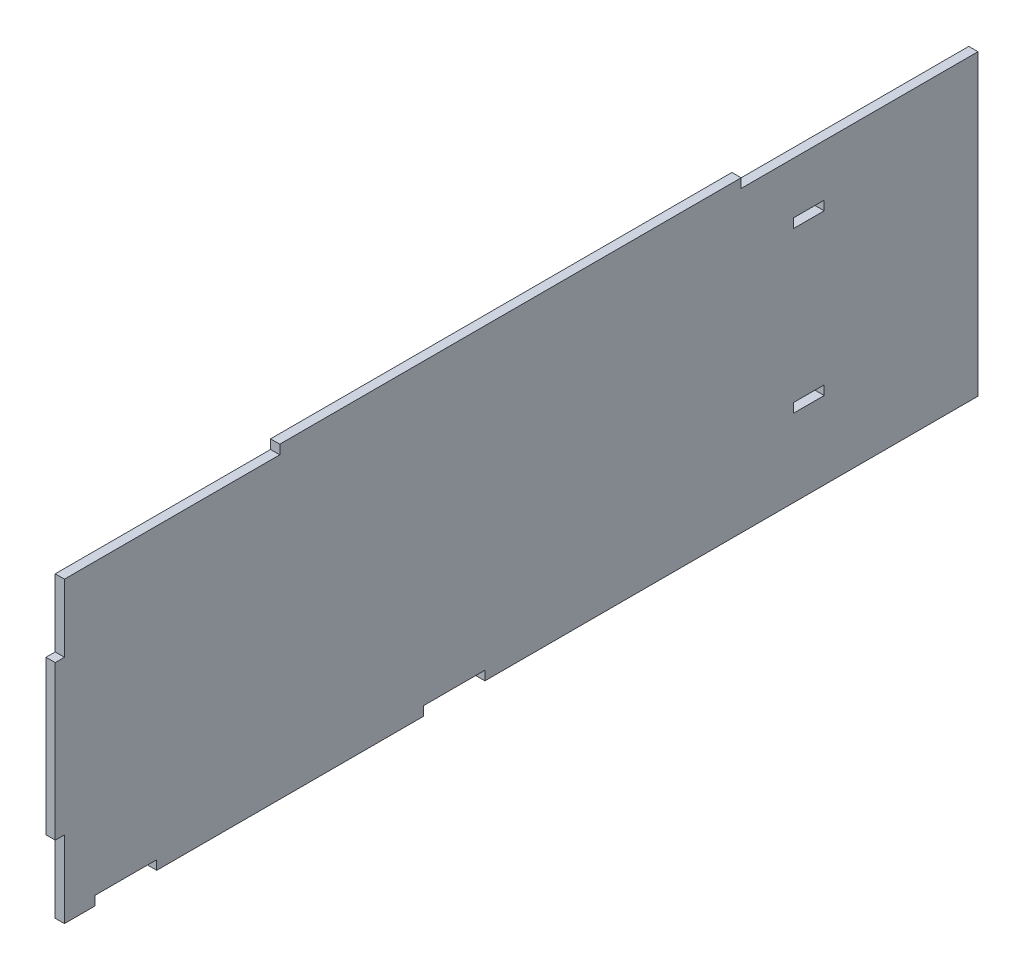
ISO-10303-21;
HEADER;
FILE_DESCRIPTION(('STEP AP214'),'2;1');
FILE_NAME('part.step','',(''),(''),'','','');
FILE_SCHEMA(('AUTOMOTIVE_DESIGN { 1 0 10303 214 1 1 1 1 }'));
ENDSEC;
DATA;
#1=APPLICATION_CONTEXT('core data for automotive mechanical design processes');
#2=APPLICATION_PROTOCOL_DEFINITION('international standard','automotive_design',2000,#1);
#3=PRODUCT_CONTEXT('',#1,'mechanical');
#4=PRODUCT('Part','Part','',(#3));
#5=PRODUCT_RELATED_PRODUCT_CATEGORY('part','',(#4));
#6=PRODUCT_DEFINITION_FORMATION('','',#4);
#7=PRODUCT_DEFINITION_CONTEXT('part definition',#1,'design');
#8=PRODUCT_DEFINITION('design','',#6,#7);
#9=PRODUCT_DEFINITION_SHAPE('','',#8);
#10=(LENGTH_UNIT() NAMED_UNIT(*) SI_UNIT(.MILLI.,.METRE.));
#11=(NAMED_UNIT(*) PLANE_ANGLE_UNIT() SI_UNIT($,.RADIAN.));
#12=(NAMED_UNIT(*) SI_UNIT($,.STERADIAN.) SOLID_ANGLE_UNIT());
#13=UNCERTAINTY_MEASURE_WITH_UNIT(LENGTH_MEASURE(1.E-05),#10,'distance_accuracy_value','');
#14=(GEOMETRIC_REPRESENTATION_CONTEXT(3) GLOBAL_UNCERTAINTY_ASSIGNED_CONTEXT((#13)) GLOBAL_UNIT_ASSIGNED_CONTEXT((#10,
#11,#12)) REPRESENTATION_CONTEXT('',''));
#15=CARTESIAN_POINT('',(0.,0.,0.));
#16=DIRECTION('',(0.,0.,1.));
#17=DIRECTION('',(1.,0.,0.));
#18=AXIS2_PLACEMENT_3D('',#15,#16,#17);
#19=CARTESIAN_POINT('',(3.,25.563482829877,-113.298102998696));
#20=DIRECTION('',(0.,0.,-1.));
#21=DIRECTION('',(-1.,0.,0.));
#22=AXIS2_PLACEMENT_3D('',#19,#20,#21);
#23=PLANE('',#22);
#24=DIRECTION('',(0.,-1.,0.));
#25=VECTOR('',#24,1.);
#26=CARTESIAN_POINT('',(0.,25.563482829877,-113.298102998696));
#27=LINE('',#26,#25);
#28=CARTESIAN_POINT('',(0.,25.563482829877,-113.298102998696));
#29=VERTEX_POINT('',#28);
#30=CARTESIAN_POINT('',(0.,22.563482829877,-113.298102998696));
#31=VERTEX_POINT('',#30);
#32=EDGE_CURVE('E328',#29,#31,#27,.T.);
#33=ORIENTED_EDGE('',*,*,#32,.F.);
#34=DIRECTION('',(-1.,0.,0.));
#35=VECTOR('',#34,1.);
#36=CARTESIAN_POINT('',(3.,25.563482829877,-113.298102998696));
#37=LINE('',#36,#35);
#38=CARTESIAN_POINT('',(3.,25.563482829877,-113.298102998696));
#39=VERTEX_POINT('',#38);
#40=EDGE_CURVE('E220',#39,#29,#37,.T.);
#41=ORIENTED_EDGE('',*,*,#40,.F.);
#42=DIRECTION('',(0.,-1.,0.));
#43=VECTOR('',#42,1.);
#44=CARTESIAN_POINT('',(3.,25.563482829877,-113.298102998696));
#45=LINE('',#44,#43);
#46=CARTESIAN_POINT('',(3.,22.563482829877,-113.298102998696));
#47=VERTEX_POINT('',#46);
#48=EDGE_CURVE('E216',#39,#47,#45,.T.);
#49=ORIENTED_EDGE('',*,*,#48,.T.);
#50=DIRECTION('',(-1.,0.,0.));
#51=VECTOR('',#50,1.);
#52=CARTESIAN_POINT('',(3.,22.563482829877,-113.298102998696));
#53=LINE('',#52,#51);
#54=EDGE_CURVE('E9',#47,#31,#53,.T.);
#55=ORIENTED_EDGE('',*,*,#54,.T.);
#56=EDGE_LOOP('',(#33,#41,#49,#55));
#57=FACE_BOUND('',#56,.T.);
#58=ADVANCED_FACE('F15',(#57),#23,.T.);
#59=CARTESIAN_POINT('',(3.,22.563482829877,-113.298102998696));
#60=DIRECTION('',(0.,1.,0.));
#61=DIRECTION('',(0.,0.,1.));
#62=AXIS2_PLACEMENT_3D('',#59,#60,#61);
#63=PLANE('',#62);
#64=DIRECTION('',(0.,0.,-1.));
#65=VECTOR('',#64,1.);
#66=CARTESIAN_POINT('',(0.,22.563482829877,-113.298102998696));
#67=LINE('',#66,#65);
#68=CARTESIAN_POINT('',(0.,22.563482829877,-123.298102998696));
#69=VERTEX_POINT('',#68);
#70=EDGE_CURVE('E207',#31,#69,#67,.T.);
#71=ORIENTED_EDGE('',*,*,#70,.F.);
#72=ORIENTED_EDGE('',*,*,#54,.F.);
#73=DIRECTION('',(0.,0.,-1.));
#74=VECTOR('',#73,1.);
#75=CARTESIAN_POINT('',(3.,22.563482829877,-113.298102998696));
#76=LINE('',#75,#74);
#77=CARTESIAN_POINT('',(3.,22.563482829877,-123.298102998696));
#78=VERTEX_POINT('',#77);
#79=EDGE_CURVE('E204',#47,#78,#76,.T.);
#80=ORIENTED_EDGE('',*,*,#79,.T.);
#81=DIRECTION('',(-1.,0.,0.));
#82=VECTOR('',#81,1.);
#83=CARTESIAN_POINT('',(3.,22.563482829877,-123.298102998696));
#84=LINE('',#83,#82);
#85=EDGE_CURVE('E25',#78,#69,#84,.T.);
#86=ORIENTED_EDGE('',*,*,#85,.T.);
#87=EDGE_LOOP('',(#71,#72,#80,#86));
#88=FACE_BOUND('',#87,.T.);
#89=ADVANCED_FACE('F203',(#88),#63,.T.);
#90=CARTESIAN_POINT('',(3.,22.563482829877,-123.298102998696));
#91=DIRECTION('',(0.,0.,1.));
#92=DIRECTION('',(1.,0.,0.));
#93=AXIS2_PLACEMENT_3D('',#90,#91,#92);
#94=PLANE('',#93);
#95=DIRECTION('',(0.,1.,0.));
#96=VECTOR('',#95,1.);
#97=CARTESIAN_POINT('',(0.,22.563482829877,-123.298102998696));
#98=LINE('',#97,#96);
#99=CARTESIAN_POINT('',(0.,25.563482829877,-123.298102998696));
#100=VERTEX_POINT('',#99);
#101=EDGE_CURVE('E335',#69,#100,#98,.T.);
#102=ORIENTED_EDGE('',*,*,#101,.F.);
#103=ORIENTED_EDGE('',*,*,#85,.F.);
#104=DIRECTION('',(0.,1.,0.));
#105=VECTOR('',#104,1.);
#106=CARTESIAN_POINT('',(3.,22.563482829877,-123.298102998696));
#107=LINE('',#106,#105);
#108=CARTESIAN_POINT('',(3.,25.563482829877,-123.298102998696));
#109=VERTEX_POINT('',#108);
#110=EDGE_CURVE('E217',#78,#109,#107,.T.);
#111=ORIENTED_EDGE('',*,*,#110,.T.);
#112=DIRECTION('',(-1.,0.,0.));
#113=VECTOR('',#112,1.);
#114=CARTESIAN_POINT('',(3.,25.563482829877,-123.298102998696));
#115=LINE('',#114,#113);
#116=EDGE_CURVE('E118',#109,#100,#115,.T.);
#117=ORIENTED_EDGE('',*,*,#116,.T.);
#118=EDGE_LOOP('',(#102,#103,#111,#117));
#119=FACE_BOUND('',#118,.T.);
#120=ADVANCED_FACE('F459',(#119),#94,.T.);
#121=CARTESIAN_POINT('',(3.,-54.636517170123,113.701897001304));
#122=DIRECTION('',(0.,-1.,0.));
#123=DIRECTION('',(0.,0.,-1.));
#124=AXIS2_PLACEMENT_3D('',#121,#122,#123);
#125=PLANE('',#124);
#126=DIRECTION('',(0.,0.,1.));
#127=VECTOR('',#126,1.);
#128=CARTESIAN_POINT('',(0.,-54.636517170123,113.701897001304));
#129=LINE('',#128,#127);
#130=CARTESIAN_POINT('',(0.,-54.636517170123,113.701897001304));
#131=VERTEX_POINT('',#130);
#132=CARTESIAN_POINT('',(0.,-54.636517170123,123.701897001304));
#133=VERTEX_POINT('',#132);
#134=EDGE_CURVE('E237',#131,#133,#129,.T.);
#135=ORIENTED_EDGE('',*,*,#134,.F.);
#136=DIRECTION('',(-1.,0.,0.));
#137=VECTOR('',#136,1.);
#138=CARTESIAN_POINT('',(3.,-54.636517170123,113.701897001304));
#139=LINE('',#138,#137);
#140=CARTESIAN_POINT('',(3.,-54.636517170123,113.701897001304));
#141=VERTEX_POINT('',#140);
#142=EDGE_CURVE('E351',#141,#131,#139,.T.);
#143=ORIENTED_EDGE('',*,*,#142,.F.);
#144=DIRECTION('',(0.,0.,1.));
#145=VECTOR('',#144,1.);
#146=CARTESIAN_POINT('',(3.,-54.636517170123,113.701897001304));
#147=LINE('',#146,#145);
#148=CARTESIAN_POINT('',(3.,-54.636517170123,123.701897001304));
#149=VERTEX_POINT('',#148);
#150=EDGE_CURVE('E341',#141,#149,#147,.T.);
#151=ORIENTED_EDGE('',*,*,#150,.T.);
#152=DIRECTION('',(-1.,0.,0.));
#153=VECTOR('',#152,1.);
#154=CARTESIAN_POINT('',(3.,-54.636517170123,123.701897001304));
#155=LINE('',#154,#153);
#156=EDGE_CURVE('E19',#149,#133,#155,.T.);
#157=ORIENTED_EDGE('',*,*,#156,.T.);
#158=EDGE_LOOP('',(#135,#143,#151,#157));
#159=FACE_BOUND('',#158,.T.);
#160=ADVANCED_FACE('F17',(#159),#125,.T.);
#161=CARTESIAN_POINT('',(3.,-54.636517170123,123.701897001304));
#162=DIRECTION('',(0.,0.,1.));
#163=DIRECTION('',(1.,0.,0.));
#164=AXIS2_PLACEMENT_3D('',#161,#162,#163);
#165=PLANE('',#164);
#166=DIRECTION('',(0.,1.,0.));
#167=VECTOR('',#166,1.);
#168=CARTESIAN_POINT('',(0.,-54.636517170123,123.701897001304));
#169=LINE('',#168,#167);
#170=CARTESIAN_POINT('',(0.,-29.636517170123,123.701897001304));
#171=VERTEX_POINT('',#170);
#172=EDGE_CURVE('E232',#133,#171,#169,.T.);
#173=ORIENTED_EDGE('',*,*,#172,.F.);
#174=ORIENTED_EDGE('',*,*,#156,.F.);
#175=DIRECTION('',(0.,1.,0.));
#176=VECTOR('',#175,1.);
#177=CARTESIAN_POINT('',(3.,-54.636517170123,123.701897001304));
#178=LINE('',#177,#176);
#179=CARTESIAN_POINT('',(3.,-29.636517170123,123.701897001304));
#180=VERTEX_POINT('',#179);
#181=EDGE_CURVE('E411',#149,#180,#178,.T.);
#182=ORIENTED_EDGE('',*,*,#181,.T.);
#183=DIRECTION('',(-1.,0.,0.));
#184=VECTOR('',#183,1.);
#185=CARTESIAN_POINT('',(3.,-29.636517170123,123.701897001304));
#186=LINE('',#185,#184);
#187=EDGE_CURVE('E387',#180,#171,#186,.T.);
#188=ORIENTED_EDGE('',*,*,#187,.T.);
#189=EDGE_LOOP('',(#173,#174,#182,#188));
#190=FACE_BOUND('',#189,.T.);
#191=ADVANCED_FACE('F393',(#190),#165,.T.);
#192=CARTESIAN_POINT('',(3.,-29.636517170123,123.701897001304));
#193=DIRECTION('',(0.,-1.,0.));
#194=DIRECTION('',(0.,0.,-1.));
#195=AXIS2_PLACEMENT_3D('',#192,#193,#194);
#196=PLANE('',#195);
#197=DIRECTION('',(0.,0.,1.));
#198=VECTOR('',#197,1.);
#199=CARTESIAN_POINT('',(0.,-29.636517170123,123.701897001304));
#200=LINE('',#199,#198);
#201=CARTESIAN_POINT('',(0.,-29.636517170123,126.701897001304));
#202=VERTEX_POINT('',#201);
#203=EDGE_CURVE('E236',#171,#202,#200,.T.);
#204=ORIENTED_EDGE('',*,*,#203,.F.);
#205=ORIENTED_EDGE('',*,*,#187,.F.);
#206=DIRECTION('',(0.,0.,1.));
#207=VECTOR('',#206,1.);
#208=CARTESIAN_POINT('',(3.,-29.636517170123,123.701897001304));
#209=LINE('',#208,#207);
#210=CARTESIAN_POINT('',(3.,-29.636517170123,126.701897001304));
#211=VERTEX_POINT('',#210);
#212=EDGE_CURVE('E413',#180,#211,#209,.T.);
#213=ORIENTED_EDGE('',*,*,#212,.T.);
#214=DIRECTION('',(-1.,0.,0.));
#215=VECTOR('',#214,1.);
#216=CARTESIAN_POINT('',(3.,-29.636517170123,126.701897001304));
#217=LINE('',#216,#215);
#218=EDGE_CURVE('E386',#211,#202,#217,.T.);
#219=ORIENTED_EDGE('',*,*,#218,.T.);
#220=EDGE_LOOP('',(#204,#205,#213,#219));
#221=FACE_BOUND('',#220,.T.);
#222=ADVANCED_FACE('F533',(#221),#196,.T.);
#223=CARTESIAN_POINT('',(3.,-29.636517170123,126.701897001304));
#224=DIRECTION('',(0.,0.,1.));
#225=DIRECTION('',(1.,0.,0.));
#226=AXIS2_PLACEMENT_3D('',#223,#224,#225);
#227=PLANE('',#226);
#228=DIRECTION('',(0.,1.,0.));
#229=VECTOR('',#228,1.);
#230=CARTESIAN_POINT('',(0.,-29.636517170123,126.701897001304));
#231=LINE('',#230,#229);
#232=CARTESIAN_POINT('',(0.,20.363482829877,126.701897001304));
#233=VERTEX_POINT('',#232);
#234=EDGE_CURVE('E241',#202,#233,#231,.T.);
#235=ORIENTED_EDGE('',*,*,#234,.F.);
#236=ORIENTED_EDGE('',*,*,#218,.F.);
#237=DIRECTION('',(0.,1.,0.));
#238=VECTOR('',#237,1.);
#239=CARTESIAN_POINT('',(3.,-29.636517170123,126.701897001304));
#240=LINE('',#239,#238);
#241=CARTESIAN_POINT('',(3.,20.363482829877,126.701897001304));
#242=VERTEX_POINT('',#241);
#243=EDGE_CURVE('E916',#211,#242,#240,.T.);
#244=ORIENTED_EDGE('',*,*,#243,.T.);
#245=DIRECTION('',(-1.,0.,0.));
#246=VECTOR('',#245,1.);
#247=CARTESIAN_POINT('',(3.,20.363482829877,126.701897001304));
#248=LINE('',#247,#246);
#249=EDGE_CURVE('E384',#242,#233,#248,.T.);
#250=ORIENTED_EDGE('',*,*,#249,.T.);
#251=EDGE_LOOP('',(#235,#236,#244,#250));
#252=FACE_BOUND('',#251,.T.);
#253=ADVANCED_FACE('F529',(#252),#227,.T.);
#254=CARTESIAN_POINT('',(3.,20.363482829877,126.701897001304));
#255=DIRECTION('',(0.,1.,0.));
#256=DIRECTION('',(0.,0.,1.));
#257=AXIS2_PLACEMENT_3D('',#254,#255,#256);
#258=PLANE('',#257);
#259=DIRECTION('',(0.,0.,-1.));
#260=VECTOR('',#259,1.);
#261=CARTESIAN_POINT('',(0.,20.363482829877,126.701897001304));
#262=LINE('',#261,#260);
#263=CARTESIAN_POINT('',(0.,20.363482829877,123.701897001304));
#264=VERTEX_POINT('',#263);
#265=EDGE_CURVE('E245',#233,#264,#262,.T.);
#266=ORIENTED_EDGE('',*,*,#265,.F.);
#267=ORIENTED_EDGE('',*,*,#249,.F.);
#268=DIRECTION('',(0.,0.,-1.));
#269=VECTOR('',#268,1.);
#270=CARTESIAN_POINT('',(3.,20.363482829877,126.701897001304));
#271=LINE('',#270,#269);
#272=CARTESIAN_POINT('',(3.,20.363482829877,123.701897001304));
#273=VERTEX_POINT('',#272);
#274=EDGE_CURVE('E920',#242,#273,#271,.T.);
#275=ORIENTED_EDGE('',*,*,#274,.T.);
#276=DIRECTION('',(-1.,0.,0.));
#277=VECTOR('',#276,1.);
#278=CARTESIAN_POINT('',(3.,20.363482829877,123.701897001304));
#279=LINE('',#278,#277);
#280=EDGE_CURVE('E382',#273,#264,#279,.T.);
#281=ORIENTED_EDGE('',*,*,#280,.T.);
#282=EDGE_LOOP('',(#266,#267,#275,#281));
#283=FACE_BOUND('',#282,.T.);
#284=ADVANCED_FACE('F525',(#283),#258,.T.);
#285=CARTESIAN_POINT('',(3.,20.363482829877,123.701897001304));
#286=DIRECTION('',(0.,0.,1.));
#287=DIRECTION('',(1.,0.,0.));
#288=AXIS2_PLACEMENT_3D('',#285,#286,#287);
#289=PLANE('',#288);
#290=DIRECTION('',(0.,1.,0.));
#291=VECTOR('',#290,1.);
#292=CARTESIAN_POINT('',(0.,20.363482829877,123.701897001304));
#293=LINE('',#292,#291);
#294=CARTESIAN_POINT('',(0.,42.363482829877,123.701897001304));
#295=VERTEX_POINT('',#294);
#296=EDGE_CURVE('E249',#264,#295,#293,.T.);
#297=ORIENTED_EDGE('',*,*,#296,.F.);
#298=ORIENTED_EDGE('',*,*,#280,.F.);
#299=DIRECTION('',(0.,1.,0.));
#300=VECTOR('',#299,1.);
#301=CARTESIAN_POINT('',(3.,20.363482829877,123.701897001304));
#302=LINE('',#301,#300);
#303=CARTESIAN_POINT('',(3.,42.363482829877,123.701897001304));
#304=VERTEX_POINT('',#303);
#305=EDGE_CURVE('E984',#273,#304,#302,.T.);
#306=ORIENTED_EDGE('',*,*,#305,.T.);
#307=DIRECTION('',(-1.,0.,0.));
#308=VECTOR('',#307,1.);
#309=CARTESIAN_POINT('',(3.,42.363482829877,123.701897001304));
#310=LINE('',#309,#308);
#311=EDGE_CURVE('E380',#304,#295,#310,.T.);
#312=ORIENTED_EDGE('',*,*,#311,.T.);
#313=EDGE_LOOP('',(#297,#298,#306,#312));
#314=FACE_BOUND('',#313,.T.);
#315=ADVANCED_FACE('F521',(#314),#289,.T.);
#316=CARTESIAN_POINT('',(3.,42.363482829877,123.701897001304));
#317=DIRECTION('',(0.,1.,0.));
#318=DIRECTION('',(0.,0.,1.));
#319=AXIS2_PLACEMENT_3D('',#316,#317,#318);
#320=PLANE('',#319);
#321=DIRECTION('',(0.,0.,-1.));
#322=VECTOR('',#321,1.);
#323=CARTESIAN_POINT('',(0.,42.363482829877,123.701897001304));
#324=LINE('',#323,#322);
#325=CARTESIAN_POINT('',(0.,42.363482829877,53.7018970013037));
#326=VERTEX_POINT('',#325);
#327=EDGE_CURVE('E253',#295,#326,#324,.T.);
#328=ORIENTED_EDGE('',*,*,#327,.F.);
#329=ORIENTED_EDGE('',*,*,#311,.F.);
#330=DIRECTION('',(0.,0.,-1.));
#331=VECTOR('',#330,1.);
#332=CARTESIAN_POINT('',(3.,42.363482829877,123.701897001304));
#333=LINE('',#332,#331);
#334=CARTESIAN_POINT('',(3.,42.363482829877,53.7018970013037));
#335=VERTEX_POINT('',#334);
#336=EDGE_CURVE('E927',#304,#335,#333,.T.);
#337=ORIENTED_EDGE('',*,*,#336,.T.);
#338=DIRECTION('',(-1.,0.,0.));
#339=VECTOR('',#338,1.);
#340=CARTESIAN_POINT('',(3.,42.363482829877,53.7018970013037));
#341=LINE('',#340,#339);
#342=EDGE_CURVE('E378',#335,#326,#341,.T.);
#343=ORIENTED_EDGE('',*,*,#342,.T.);
#344=EDGE_LOOP('',(#328,#329,#337,#343));
#345=FACE_BOUND('',#344,.T.);
#346=ADVANCED_FACE('F517',(#345),#320,.T.);
#347=CARTESIAN_POINT('',(3.,42.363482829877,53.7018970013037));
#348=DIRECTION('',(0.,0.,1.));
#349=DIRECTION('',(1.,0.,0.));
#350=AXIS2_PLACEMENT_3D('',#347,#348,#349);
#351=PLANE('',#350);
#352=DIRECTION('',(0.,1.,0.));
#353=VECTOR('',#352,1.);
#354=CARTESIAN_POINT('',(0.,42.363482829877,53.7018970013037));
#355=LINE('',#354,#353);
#356=CARTESIAN_POINT('',(0.,45.363482829877,53.7018970013037));
#357=VERTEX_POINT('',#356);
#358=EDGE_CURVE('E257',#326,#357,#355,.T.);
#359=ORIENTED_EDGE('',*,*,#358,.F.);
#360=ORIENTED_EDGE('',*,*,#342,.F.);
#361=DIRECTION('',(0.,1.,0.));
#362=VECTOR('',#361,1.);
#363=CARTESIAN_POINT('',(3.,42.363482829877,53.7018970013037));
#364=LINE('',#363,#362);
#365=CARTESIAN_POINT('',(3.,45.363482829877,53.7018970013037));
#366=VERTEX_POINT('',#365);
#367=EDGE_CURVE('E931',#335,#366,#364,.T.);
#368=ORIENTED_EDGE('',*,*,#367,.T.);
#369=DIRECTION('',(-1.,0.,0.));
#370=VECTOR('',#369,1.);
#371=CARTESIAN_POINT('',(3.,45.363482829877,53.7018970013037));
#372=LINE('',#371,#370);
#373=EDGE_CURVE('E376',#366,#357,#372,.T.);
#374=ORIENTED_EDGE('',*,*,#373,.T.);
#375=EDGE_LOOP('',(#359,#360,#368,#374));
#376=FACE_BOUND('',#375,.T.);
#377=ADVANCED_FACE('F513',(#376),#351,.T.);
#378=CARTESIAN_POINT('',(3.,45.363482829877,53.7018970013037));
#379=DIRECTION('',(0.,1.,0.));
#380=DIRECTION('',(0.,0.,1.));
#381=AXIS2_PLACEMENT_3D('',#378,#379,#380);
#382=PLANE('',#381);
#383=DIRECTION('',(0.,0.,-1.));
#384=VECTOR('',#383,1.);
#385=CARTESIAN_POINT('',(0.,45.363482829877,53.7018970013037));
#386=LINE('',#385,#384);
#387=CARTESIAN_POINT('',(0.,45.363482829877,-96.2981029986963));
#388=VERTEX_POINT('',#387);
#389=EDGE_CURVE('E261',#357,#388,#386,.T.);
#390=ORIENTED_EDGE('',*,*,#389,.F.);
#391=ORIENTED_EDGE('',*,*,#373,.F.);
#392=DIRECTION('',(0.,0.,-1.));
#393=VECTOR('',#392,1.);
#394=CARTESIAN_POINT('',(3.,45.363482829877,53.7018970013037));
#395=LINE('',#394,#393);
#396=CARTESIAN_POINT('',(3.,45.363482829877,-96.2981029986963));
#397=VERTEX_POINT('',#396);
#398=EDGE_CURVE('E980',#366,#397,#395,.T.);
#399=ORIENTED_EDGE('',*,*,#398,.T.);
#400=DIRECTION('',(-1.,0.,0.));
#401=VECTOR('',#400,1.);
#402=CARTESIAN_POINT('',(3.,45.363482829877,-96.2981029986963));
#403=LINE('',#402,#401);
#404=EDGE_CURVE('E374',#397,#388,#403,.T.);
#405=ORIENTED_EDGE('',*,*,#404,.T.);
#406=EDGE_LOOP('',(#390,#391,#399,#405));
#407=FACE_BOUND('',#406,.T.);
#408=ADVANCED_FACE('F509',(#407),#382,.T.);
#409=CARTESIAN_POINT('',(3.,45.363482829877,-96.2981029986963));
#410=DIRECTION('',(0.,0.,-1.));
#411=DIRECTION('',(-1.,0.,0.));
#412=AXIS2_PLACEMENT_3D('',#409,#410,#411);
#413=PLANE('',#412);
#414=DIRECTION('',(0.,-1.,0.));
#415=VECTOR('',#414,1.);
#416=CARTESIAN_POINT('',(0.,45.363482829877,-96.2981029986963));
#417=LINE('',#416,#415);
#418=CARTESIAN_POINT('',(0.,42.363482829877,-96.2981029986963));
#419=VERTEX_POINT('',#418);
#420=EDGE_CURVE('E265',#388,#419,#417,.T.);
#421=ORIENTED_EDGE('',*,*,#420,.F.);
#422=ORIENTED_EDGE('',*,*,#404,.F.);
#423=DIRECTION('',(0.,-1.,0.));
#424=VECTOR('',#423,1.);
#425=CARTESIAN_POINT('',(3.,45.363482829877,-96.2981029986963));
#426=LINE('',#425,#424);
#427=CARTESIAN_POINT('',(3.,42.363482829877,-96.2981029986963));
#428=VERTEX_POINT('',#427);
#429=EDGE_CURVE('E938',#397,#428,#426,.T.);
#430=ORIENTED_EDGE('',*,*,#429,.T.);
#431=DIRECTION('',(-1.,0.,0.));
#432=VECTOR('',#431,1.);
#433=CARTESIAN_POINT('',(3.,42.363482829877,-96.2981029986963));
#434=LINE('',#433,#432);
#435=EDGE_CURVE('E372',#428,#419,#434,.T.);
#436=ORIENTED_EDGE('',*,*,#435,.T.);
#437=EDGE_LOOP('',(#421,#422,#430,#436));
#438=FACE_BOUND('',#437,.T.);
#439=ADVANCED_FACE('F505',(#438),#413,.T.);
#440=CARTESIAN_POINT('',(3.,42.363482829877,-96.2981029986963));
#441=DIRECTION('',(0.,1.,0.));
#442=DIRECTION('',(0.,0.,1.));
#443=AXIS2_PLACEMENT_3D('',#440,#441,#442);
#444=PLANE('',#443);
#445=DIRECTION('',(0.,0.,-1.));
#446=VECTOR('',#445,1.);
#447=CARTESIAN_POINT('',(0.,42.363482829877,-96.2981029986963));
#448=LINE('',#447,#446);
#449=CARTESIAN_POINT('',(0.,42.363482829877,-173.298102998696));
#450=VERTEX_POINT('',#449);
#451=EDGE_CURVE('E269',#419,#450,#448,.T.);
#452=ORIENTED_EDGE('',*,*,#451,.F.);
#453=ORIENTED_EDGE('',*,*,#435,.F.);
#454=DIRECTION('',(0.,0.,-1.));
#455=VECTOR('',#454,1.);
#456=CARTESIAN_POINT('',(3.,42.363482829877,-96.2981029986963));
#457=LINE('',#456,#455);
#458=CARTESIAN_POINT('',(3.,42.363482829877,-173.298102998696));
#459=VERTEX_POINT('',#458);
#460=EDGE_CURVE('E942',#428,#459,#457,.T.);
#461=ORIENTED_EDGE('',*,*,#460,.T.);
#462=DIRECTION('',(-1.,0.,0.));
#463=VECTOR('',#462,1.);
#464=CARTESIAN_POINT('',(3.,42.363482829877,-173.298102998696));
#465=LINE('',#464,#463);
#466=EDGE_CURVE('E370',#459,#450,#465,.T.);
#467=ORIENTED_EDGE('',*,*,#466,.T.);
#468=EDGE_LOOP('',(#452,#453,#461,#467));
#469=FACE_BOUND('',#468,.T.);
#470=ADVANCED_FACE('F501',(#469),#444,.T.);
#471=CARTESIAN_POINT('',(3.,42.363482829877,-173.298102998696));
#472=DIRECTION('',(0.,0.,-1.));
#473=DIRECTION('',(-1.,0.,0.));
#474=AXIS2_PLACEMENT_3D('',#471,#472,#473);
#475=PLANE('',#474);
#476=DIRECTION('',(0.,-1.,0.));
#477=VECTOR('',#476,1.);
#478=CARTESIAN_POINT('',(0.,42.363482829877,-173.298102998696));
#479=LINE('',#478,#477);
#480=CARTESIAN_POINT('',(0.,-54.636517170123,-173.298102998696));
#481=VERTEX_POINT('',#480);
#482=EDGE_CURVE('E273',#450,#481,#479,.T.);
#483=ORIENTED_EDGE('',*,*,#482,.F.);
#484=ORIENTED_EDGE('',*,*,#466,.F.);
#485=DIRECTION('',(0.,-1.,0.));
#486=VECTOR('',#485,1.);
#487=CARTESIAN_POINT('',(3.,42.363482829877,-173.298102998696));
#488=LINE('',#487,#486);
#489=CARTESIAN_POINT('',(3.,-54.636517170123,-173.298102998696));
#490=VERTEX_POINT('',#489);
#491=EDGE_CURVE('E976',#459,#490,#488,.T.);
#492=ORIENTED_EDGE('',*,*,#491,.T.);
#493=DIRECTION('',(-1.,0.,0.));
#494=VECTOR('',#493,1.);
#495=CARTESIAN_POINT('',(3.,-54.636517170123,-173.298102998696));
#496=LINE('',#495,#494);
#497=EDGE_CURVE('E368',#490,#481,#496,.T.);
#498=ORIENTED_EDGE('',*,*,#497,.T.);
#499=EDGE_LOOP('',(#483,#484,#492,#498));
#500=FACE_BOUND('',#499,.T.);
#501=ADVANCED_FACE('F497',(#500),#475,.T.);
#502=CARTESIAN_POINT('',(3.,-54.636517170123,-173.298102998696));
#503=DIRECTION('',(0.,-1.,0.));
#504=DIRECTION('',(0.,0.,-1.));
#505=AXIS2_PLACEMENT_3D('',#502,#503,#504);
#506=PLANE('',#505);
#507=DIRECTION('',(0.,0.,1.));
#508=VECTOR('',#507,1.);
#509=CARTESIAN_POINT('',(0.,-54.636517170123,-173.298102998696));
#510=LINE('',#509,#508);
#511=CARTESIAN_POINT('',(0.,-54.636517170123,-12.9981029986962));
#512=VERTEX_POINT('',#511);
#513=EDGE_CURVE('E277',#481,#512,#510,.T.);
#514=ORIENTED_EDGE('',*,*,#513,.F.);
#515=ORIENTED_EDGE('',*,*,#497,.F.);
#516=DIRECTION('',(0.,0.,1.));
#517=VECTOR('',#516,1.);
#518=CARTESIAN_POINT('',(3.,-54.636517170123,-173.298102998696));
#519=LINE('',#518,#517);
#520=CARTESIAN_POINT('',(3.,-54.636517170123,-12.9981029986962));
#521=VERTEX_POINT('',#520);
#522=EDGE_CURVE('E949',#490,#521,#519,.T.);
#523=ORIENTED_EDGE('',*,*,#522,.T.);
#524=DIRECTION('',(-1.,0.,0.));
#525=VECTOR('',#524,1.);
#526=CARTESIAN_POINT('',(3.,-54.636517170123,-12.9981029986962));
#527=LINE('',#526,#525);
#528=EDGE_CURVE('E366',#521,#512,#527,.T.);
#529=ORIENTED_EDGE('',*,*,#528,.T.);
#530=EDGE_LOOP('',(#514,#515,#523,#529));
#531=FACE_BOUND('',#530,.T.);
#532=ADVANCED_FACE('F493',(#531),#506,.T.);
#533=CARTESIAN_POINT('',(3.,-51.636517170123,-12.9981029986963));
#534=DIRECTION('',(0.,0.,1.));
#535=DIRECTION('',(1.,0.,0.));
#536=AXIS2_PLACEMENT_3D('',#533,#534,#535);
#537=PLANE('',#536);
#538=DIRECTION('',(0.,1.,0.));
#539=VECTOR('',#538,1.);
#540=CARTESIAN_POINT('',(0.,-51.636517170123,-12.9981029986963));
#541=LINE('',#540,#539);
#542=CARTESIAN_POINT('',(0.,-51.636517170123,-12.9981029986963));
#543=VERTEX_POINT('',#542);
#544=EDGE_CURVE('E281',#512,#543,#541,.T.);
#545=ORIENTED_EDGE('',*,*,#544,.F.);
#546=ORIENTED_EDGE('',*,*,#528,.F.);
#547=DIRECTION('',(0.,1.,0.));
#548=VECTOR('',#547,1.);
#549=CARTESIAN_POINT('',(3.,-51.636517170123,-12.9981029986963));
#550=LINE('',#549,#548);
#551=CARTESIAN_POINT('',(3.,-51.636517170123,-12.9981029986963));
#552=VERTEX_POINT('',#551);
#553=EDGE_CURVE('E953',#521,#552,#550,.T.);
#554=ORIENTED_EDGE('',*,*,#553,.T.);
#555=DIRECTION('',(-1.,0.,0.));
#556=VECTOR('',#555,1.);
#557=CARTESIAN_POINT('',(3.,-51.636517170123,-12.9981029986963));
#558=LINE('',#557,#556);
#559=EDGE_CURVE('E364',#552,#543,#558,.T.);
#560=ORIENTED_EDGE('',*,*,#559,.T.);
#561=EDGE_LOOP('',(#545,#546,#554,#560));
#562=FACE_BOUND('',#561,.T.);
#563=ADVANCED_FACE('F489',(#562),#537,.T.);
#564=CARTESIAN_POINT('',(3.,-51.636517170123,7.00189700130374));
#565=DIRECTION('',(0.,-1.,0.));
#566=DIRECTION('',(0.,0.,-1.));
#567=AXIS2_PLACEMENT_3D('',#564,#565,#566);
#568=PLANE('',#567);
#569=DIRECTION('',(0.,0.,1.));
#570=VECTOR('',#569,1.);
#571=CARTESIAN_POINT('',(0.,-51.636517170123,7.00189700130374));
#572=LINE('',#571,#570);
#573=CARTESIAN_POINT('',(0.,-51.636517170123,7.00189700130374));
#574=VERTEX_POINT('',#573);
#575=EDGE_CURVE('E285',#543,#574,#572,.T.);
#576=ORIENTED_EDGE('',*,*,#575,.F.);
#577=ORIENTED_EDGE('',*,*,#559,.F.);
#578=DIRECTION('',(0.,0.,1.));
#579=VECTOR('',#578,1.);
#580=CARTESIAN_POINT('',(3.,-51.636517170123,7.00189700130374));
#581=LINE('',#580,#579);
#582=CARTESIAN_POINT('',(3.,-51.636517170123,7.00189700130374));
#583=VERTEX_POINT('',#582);
#584=EDGE_CURVE('E972',#552,#583,#581,.T.);
#585=ORIENTED_EDGE('',*,*,#584,.T.);
#586=DIRECTION('',(-1.,0.,0.));
#587=VECTOR('',#586,1.);
#588=CARTESIAN_POINT('',(3.,-51.636517170123,7.00189700130374));
#589=LINE('',#588,#587);
#590=EDGE_CURVE('E362',#583,#574,#589,.T.);
#591=ORIENTED_EDGE('',*,*,#590,.T.);
#592=EDGE_LOOP('',(#576,#577,#585,#591));
#593=FACE_BOUND('',#592,.T.);
#594=ADVANCED_FACE('F485',(#593),#568,.T.);
#595=CARTESIAN_POINT('',(3.,-54.636517170123,7.00189700130374));
#596=DIRECTION('',(0.,0.,-1.));
#597=DIRECTION('',(-1.,0.,0.));
#598=AXIS2_PLACEMENT_3D('',#595,#596,#597);
#599=PLANE('',#598);
#600=DIRECTION('',(0.,-1.,0.));
#601=VECTOR('',#600,1.);
#602=CARTESIAN_POINT('',(0.,-54.636517170123,7.00189700130374));
#603=LINE('',#602,#601);
#604=CARTESIAN_POINT('',(0.,-54.636517170123,7.00189700130374));
#605=VERTEX_POINT('',#604);
#606=EDGE_CURVE('E289',#574,#605,#603,.T.);
#607=ORIENTED_EDGE('',*,*,#606,.F.);
#608=ORIENTED_EDGE('',*,*,#590,.F.);
#609=DIRECTION('',(0.,-1.,0.));
#610=VECTOR('',#609,1.);
#611=CARTESIAN_POINT('',(3.,-54.636517170123,7.00189700130374));
#612=LINE('',#611,#610);
#613=CARTESIAN_POINT('',(3.,-54.636517170123,7.00189700130374));
#614=VERTEX_POINT('',#613);
#615=EDGE_CURVE('E960',#583,#614,#612,.T.);
#616=ORIENTED_EDGE('',*,*,#615,.T.);
#617=DIRECTION('',(-1.,0.,0.));
#618=VECTOR('',#617,1.);
#619=CARTESIAN_POINT('',(3.,-54.636517170123,7.00189700130374));
#620=LINE('',#619,#618);
#621=EDGE_CURVE('E360',#614,#605,#620,.T.);
#622=ORIENTED_EDGE('',*,*,#621,.T.);
#623=EDGE_LOOP('',(#607,#608,#616,#622));
#624=FACE_BOUND('',#623,.T.);
#625=ADVANCED_FACE('F481',(#624),#599,.T.);
#626=CARTESIAN_POINT('',(3.,-54.636517170123,7.00189700130374));
#627=DIRECTION('',(0.,-1.,0.));
#628=DIRECTION('',(0.,0.,-1.));
#629=AXIS2_PLACEMENT_3D('',#626,#627,#628);
#630=PLANE('',#629);
#631=DIRECTION('',(0.,0.,1.));
#632=VECTOR('',#631,1.);
#633=CARTESIAN_POINT('',(0.,-54.636517170123,7.00189700130374));
#634=LINE('',#633,#632);
#635=CARTESIAN_POINT('',(0.,-54.636517170123,93.7018970013037));
#636=VERTEX_POINT('',#635);
#637=EDGE_CURVE('E293',#605,#636,#634,.T.);
#638=ORIENTED_EDGE('',*,*,#637,.F.);
#639=ORIENTED_EDGE('',*,*,#621,.F.);
#640=DIRECTION('',(0.,0.,1.));
#641=VECTOR('',#640,1.);
#642=CARTESIAN_POINT('',(3.,-54.636517170123,7.00189700130374));
#643=LINE('',#642,#641);
#644=CARTESIAN_POINT('',(3.,-54.636517170123,93.7018970013037));
#645=VERTEX_POINT('',#644);
#646=EDGE_CURVE('E964',#614,#645,#643,.T.);
#647=ORIENTED_EDGE('',*,*,#646,.T.);
#648=DIRECTION('',(-1.,0.,0.));
#649=VECTOR('',#648,1.);
#650=CARTESIAN_POINT('',(3.,-54.636517170123,93.7018970013037));
#651=LINE('',#650,#649);
#652=EDGE_CURVE('E358',#645,#636,#651,.T.);
#653=ORIENTED_EDGE('',*,*,#652,.T.);
#654=EDGE_LOOP('',(#638,#639,#647,#653));
#655=FACE_BOUND('',#654,.T.);
#656=ADVANCED_FACE('F477',(#655),#630,.T.);
#657=CARTESIAN_POINT('',(3.,-54.636517170123,93.7018970013037));
#658=DIRECTION('',(0.,0.,1.));
#659=DIRECTION('',(1.,0.,0.));
#660=AXIS2_PLACEMENT_3D('',#657,#658,#659);
#661=PLANE('',#660);
#662=DIRECTION('',(0.,1.,0.));
#663=VECTOR('',#662,1.);
#664=CARTESIAN_POINT('',(0.,-54.636517170123,93.7018970013037));
#665=LINE('',#664,#663);
#666=CARTESIAN_POINT('',(0.,-51.636517170123,93.7018970013037));
#667=VERTEX_POINT('',#666);
#668=EDGE_CURVE('E297',#636,#667,#665,.T.);
#669=ORIENTED_EDGE('',*,*,#668,.F.);
#670=ORIENTED_EDGE('',*,*,#652,.F.);
#671=DIRECTION('',(0.,1.,0.));
#672=VECTOR('',#671,1.);
#673=CARTESIAN_POINT('',(3.,-54.636517170123,93.7018970013037));
#674=LINE('',#673,#672);
#675=CARTESIAN_POINT('',(3.,-51.636517170123,93.7018970013037));
#676=VERTEX_POINT('',#675);
#677=EDGE_CURVE('E967',#645,#676,#674,.T.);
#678=ORIENTED_EDGE('',*,*,#677,.T.);
#679=DIRECTION('',(-1.,0.,0.));
#680=VECTOR('',#679,1.);
#681=CARTESIAN_POINT('',(3.,-51.636517170123,93.7018970013037));
#682=LINE('',#681,#680);
#683=EDGE_CURVE('E356',#676,#667,#682,.T.);
#684=ORIENTED_EDGE('',*,*,#683,.T.);
#685=EDGE_LOOP('',(#669,#670,#678,#684));
#686=FACE_BOUND('',#685,.T.);
#687=ADVANCED_FACE('F449',(#686),#661,.T.);
#688=CARTESIAN_POINT('',(3.,-51.636517170123,93.7018970013037));
#689=DIRECTION('',(0.,-1.,0.));
#690=DIRECTION('',(0.,0.,-1.));
#691=AXIS2_PLACEMENT_3D('',#688,#689,#690);
#692=PLANE('',#691);
#693=DIRECTION('',(0.,0.,1.));
#694=VECTOR('',#693,1.);
#695=CARTESIAN_POINT('',(0.,-51.636517170123,93.7018970013037));
#696=LINE('',#695,#694);
#697=CARTESIAN_POINT('',(0.,-51.636517170123,113.701897001304));
#698=VERTEX_POINT('',#697);
#699=EDGE_CURVE('E301',#667,#698,#696,.T.);
#700=ORIENTED_EDGE('',*,*,#699,.F.);
#701=ORIENTED_EDGE('',*,*,#683,.F.);
#702=DIRECTION('',(0.,0.,1.));
#703=VECTOR('',#702,1.);
#704=CARTESIAN_POINT('',(3.,-51.636517170123,93.7018970013037));
#705=LINE('',#704,#703);
#706=CARTESIAN_POINT('',(3.,-51.636517170123,113.701897001304));
#707=VERTEX_POINT('',#706);
#708=EDGE_CURVE('E408',#676,#707,#705,.T.);
#709=ORIENTED_EDGE('',*,*,#708,.T.);
#710=DIRECTION('',(-1.,0.,0.));
#711=VECTOR('',#710,1.);
#712=CARTESIAN_POINT('',(3.,-51.636517170123,113.701897001304));
#713=LINE('',#712,#711);
#714=EDGE_CURVE('E354',#707,#698,#713,.T.);
#715=ORIENTED_EDGE('',*,*,#714,.T.);
#716=EDGE_LOOP('',(#700,#701,#709,#715));
#717=FACE_BOUND('',#716,.T.);
#718=ADVANCED_FACE('F441',(#717),#692,.T.);
#719=CARTESIAN_POINT('',(3.,-29.436517170123,-123.298102998696));
#720=DIRECTION('',(0.,0.,1.));
#721=DIRECTION('',(1.,0.,0.));
#722=AXIS2_PLACEMENT_3D('',#719,#720,#721);
#723=PLANE('',#722);
#724=DIRECTION('',(0.,1.,0.));
#725=VECTOR('',#724,1.);
#726=CARTESIAN_POINT('',(0.,-29.436517170123,-123.298102998696));
#727=LINE('',#726,#725);
#728=CARTESIAN_POINT('',(0.,-29.436517170123,-123.298102998696));
#729=VERTEX_POINT('',#728);
#730=CARTESIAN_POINT('',(0.,-26.436517170123,-123.298102998696));
#731=VERTEX_POINT('',#730);
#732=EDGE_CURVE('E309',#729,#731,#727,.T.);
#733=ORIENTED_EDGE('',*,*,#732,.F.);
#734=DIRECTION('',(-1.,0.,0.));
#735=VECTOR('',#734,1.);
#736=CARTESIAN_POINT('',(3.,-29.436517170123,-123.298102998696));
#737=LINE('',#736,#735);
#738=CARTESIAN_POINT('',(3.,-29.436517170123,-123.298102998696));
#739=VERTEX_POINT('',#738);
#740=EDGE_CURVE('E218',#739,#729,#737,.T.);
#741=ORIENTED_EDGE('',*,*,#740,.F.);
#742=DIRECTION('',(0.,1.,0.));
#743=VECTOR('',#742,1.);
#744=CARTESIAN_POINT('',(3.,-29.436517170123,-123.298102998696));
#745=LINE('',#744,#743);
#746=CARTESIAN_POINT('',(3.,-26.436517170123,-123.298102998696));
#747=VERTEX_POINT('',#746);
#748=EDGE_CURVE('E407',#739,#747,#745,.T.);
#749=ORIENTED_EDGE('',*,*,#748,.T.);
#750=DIRECTION('',(-1.,0.,0.));
#751=VECTOR('',#750,1.);
#752=CARTESIAN_POINT('',(3.,-26.436517170123,-123.298102998696));
#753=LINE('',#752,#751);
#754=EDGE_CURVE('E347',#747,#731,#753,.T.);
#755=ORIENTED_EDGE('',*,*,#754,.T.);
#756=EDGE_LOOP('',(#733,#741,#749,#755));
#757=FACE_BOUND('',#756,.T.);
#758=ADVANCED_FACE('F439',(#757),#723,.T.);
#759=CARTESIAN_POINT('',(3.,-26.436517170123,-123.298102998696));
#760=DIRECTION('',(0.,-1.,0.));
#761=DIRECTION('',(0.,0.,-1.));
#762=AXIS2_PLACEMENT_3D('',#759,#760,#761);
#763=PLANE('',#762);
#764=DIRECTION('',(0.,0.,1.));
#765=VECTOR('',#764,1.);
#766=CARTESIAN_POINT('',(0.,-26.436517170123,-123.298102998696));
#767=LINE('',#766,#765);
#768=CARTESIAN_POINT('',(0.,-26.436517170123,-113.298102998696));
#769=VERTEX_POINT('',#768);
#770=EDGE_CURVE('E324',#731,#769,#767,.T.);
#771=ORIENTED_EDGE('',*,*,#770,.F.);
#772=ORIENTED_EDGE('',*,*,#754,.F.);
#773=DIRECTION('',(0.,0.,1.));
#774=VECTOR('',#773,1.);
#775=CARTESIAN_POINT('',(3.,-26.436517170123,-123.298102998696));
#776=LINE('',#775,#774);
#777=CARTESIAN_POINT('',(3.,-26.436517170123,-113.298102998696));
#778=VERTEX_POINT('',#777);
#779=EDGE_CURVE('E223',#747,#778,#776,.T.);
#780=ORIENTED_EDGE('',*,*,#779,.T.);
#781=DIRECTION('',(-1.,0.,0.));
#782=VECTOR('',#781,1.);
#783=CARTESIAN_POINT('',(3.,-26.436517170123,-113.298102998696));
#784=LINE('',#783,#782);
#785=EDGE_CURVE('E345',#778,#769,#784,.T.);
#786=ORIENTED_EDGE('',*,*,#785,.T.);
#787=EDGE_LOOP('',(#771,#772,#780,#786));
#788=FACE_BOUND('',#787,.T.);
#789=ADVANCED_FACE('F437',(#788),#763,.T.);
#790=CARTESIAN_POINT('',(3.,-26.436517170123,-113.298102998696));
#791=DIRECTION('',(0.,0.,-1.));
#792=DIRECTION('',(-1.,0.,0.));
#793=AXIS2_PLACEMENT_3D('',#790,#791,#792);
#794=PLANE('',#793);
#795=DIRECTION('',(0.,-1.,0.));
#796=VECTOR('',#795,1.);
#797=CARTESIAN_POINT('',(0.,-26.436517170123,-113.298102998696));
#798=LINE('',#797,#796);
#799=CARTESIAN_POINT('',(0.,-29.436517170123,-113.298102998696));
#800=VERTEX_POINT('',#799);
#801=EDGE_CURVE('E320',#769,#800,#798,.T.);
#802=ORIENTED_EDGE('',*,*,#801,.F.);
#803=ORIENTED_EDGE('',*,*,#785,.F.);
#804=DIRECTION('',(0.,-1.,0.));
#805=VECTOR('',#804,1.);
#806=CARTESIAN_POINT('',(3.,-26.436517170123,-113.298102998696));
#807=LINE('',#806,#805);
#808=CARTESIAN_POINT('',(3.,-29.436517170123,-113.298102998696));
#809=VERTEX_POINT('',#808);
#810=EDGE_CURVE('E227',#778,#809,#807,.T.);
#811=ORIENTED_EDGE('',*,*,#810,.T.);
#812=DIRECTION('',(-1.,0.,0.));
#813=VECTOR('',#812,1.);
#814=CARTESIAN_POINT('',(3.,-29.436517170123,-113.298102998696));
#815=LINE('',#814,#813);
#816=EDGE_CURVE('E348',#809,#800,#815,.T.);
#817=ORIENTED_EDGE('',*,*,#816,.T.);
#818=EDGE_LOOP('',(#802,#803,#811,#817));
#819=FACE_BOUND('',#818,.T.);
#820=ADVANCED_FACE('F426',(#819),#794,.T.);
#821=CARTESIAN_POINT('',(3.,-51.636517170123,113.701897001304));
#822=DIRECTION('',(0.,0.,-1.));
#823=DIRECTION('',(-1.,0.,0.));
#824=AXIS2_PLACEMENT_3D('',#821,#822,#823);
#825=PLANE('',#824);
#826=DIRECTION('',(0.,-1.,0.));
#827=VECTOR('',#826,1.);
#828=CARTESIAN_POINT('',(0.,-51.636517170123,113.701897001304));
#829=LINE('',#828,#827);
#830=EDGE_CURVE('E305',#698,#131,#829,.T.);
#831=ORIENTED_EDGE('',*,*,#830,.F.);
#832=ORIENTED_EDGE('',*,*,#714,.F.);
#833=DIRECTION('',(0.,-1.,0.));
#834=VECTOR('',#833,1.);
#835=CARTESIAN_POINT('',(3.,-51.636517170123,113.701897001304));
#836=LINE('',#835,#834);
#837=EDGE_CURVE('E404',#707,#141,#836,.T.);
#838=ORIENTED_EDGE('',*,*,#837,.T.);
#839=ORIENTED_EDGE('',*,*,#142,.T.);
#840=EDGE_LOOP('',(#831,#832,#838,#839));
#841=FACE_BOUND('',#840,.T.);
#842=ADVANCED_FACE('F400',(#841),#825,.T.);
#843=CARTESIAN_POINT('',(3.,-29.436517170123,-113.298102998696));
#844=DIRECTION('',(0.,1.,0.));
#845=DIRECTION('',(0.,0.,1.));
#846=AXIS2_PLACEMENT_3D('',#843,#844,#845);
#847=PLANE('',#846);
#848=DIRECTION('',(0.,0.,-1.));
#849=VECTOR('',#848,1.);
#850=CARTESIAN_POINT('',(0.,-29.436517170123,-113.298102998696));
#851=LINE('',#850,#849);
#852=EDGE_CURVE('E316',#800,#729,#851,.T.);
#853=ORIENTED_EDGE('',*,*,#852,.F.);
#854=ORIENTED_EDGE('',*,*,#816,.F.);
#855=DIRECTION('',(0.,0.,-1.));
#856=VECTOR('',#855,1.);
#857=CARTESIAN_POINT('',(3.,-29.436517170123,-113.298102998696));
#858=LINE('',#857,#856);
#859=EDGE_CURVE('E419',#809,#739,#858,.T.);
#860=ORIENTED_EDGE('',*,*,#859,.T.);
#861=ORIENTED_EDGE('',*,*,#740,.T.);
#862=EDGE_LOOP('',(#853,#854,#860,#861));
#863=FACE_BOUND('',#862,.T.);
#864=ADVANCED_FACE('F432',(#863),#847,.T.);
#865=CARTESIAN_POINT('',(3.,25.563482829877,-123.298102998696));
#866=DIRECTION('',(0.,-1.,0.));
#867=DIRECTION('',(0.,0.,-1.));
#868=AXIS2_PLACEMENT_3D('',#865,#866,#867);
#869=PLANE('',#868);
#870=DIRECTION('',(0.,0.,1.));
#871=VECTOR('',#870,1.);
#872=CARTESIAN_POINT('',(0.,25.563482829877,-123.298102998696));
#873=LINE('',#872,#871);
#874=EDGE_CURVE('E331',#100,#29,#873,.T.);
#875=ORIENTED_EDGE('',*,*,#874,.F.);
#876=ORIENTED_EDGE('',*,*,#116,.F.);
#877=DIRECTION('',(0.,0.,1.));
#878=VECTOR('',#877,1.);
#879=CARTESIAN_POINT('',(3.,25.563482829877,-123.298102998696));
#880=LINE('',#879,#878);
#881=EDGE_CURVE('E222',#109,#39,#880,.T.);
#882=ORIENTED_EDGE('',*,*,#881,.T.);
#883=ORIENTED_EDGE('',*,*,#40,.T.);
#884=EDGE_LOOP('',(#875,#876,#882,#883));
#885=FACE_BOUND('',#884,.T.);
#886=ADVANCED_FACE('F462',(#885),#869,.T.);
#887=CARTESIAN_POINT('',(3.,0.,0.));
#888=DIRECTION('',(-1.,0.,0.));
#889=DIRECTION('',(0.,-1.,0.));
#890=AXIS2_PLACEMENT_3D('',#887,#888,#889);
#891=PLANE('',#890);
#892=ORIENTED_EDGE('',*,*,#748,.F.);
#893=ORIENTED_EDGE('',*,*,#859,.F.);
#894=ORIENTED_EDGE('',*,*,#810,.F.);
#895=ORIENTED_EDGE('',*,*,#779,.F.);
#896=EDGE_LOOP('',(#892,#893,#894,#895));
#897=FACE_BOUND('',#896,.T.);
#898=ORIENTED_EDGE('',*,*,#150,.F.);
#899=ORIENTED_EDGE('',*,*,#837,.F.);
#900=ORIENTED_EDGE('',*,*,#708,.F.);
#901=ORIENTED_EDGE('',*,*,#677,.F.);
#902=ORIENTED_EDGE('',*,*,#646,.F.);
#903=ORIENTED_EDGE('',*,*,#615,.F.);
#904=ORIENTED_EDGE('',*,*,#584,.F.);
#905=ORIENTED_EDGE('',*,*,#553,.F.);
#906=ORIENTED_EDGE('',*,*,#522,.F.);
#907=ORIENTED_EDGE('',*,*,#491,.F.);
#908=ORIENTED_EDGE('',*,*,#460,.F.);
#909=ORIENTED_EDGE('',*,*,#429,.F.);
#910=ORIENTED_EDGE('',*,*,#398,.F.);
#911=ORIENTED_EDGE('',*,*,#367,.F.);
#912=ORIENTED_EDGE('',*,*,#336,.F.);
#913=ORIENTED_EDGE('',*,*,#305,.F.);
#914=ORIENTED_EDGE('',*,*,#274,.F.);
#915=ORIENTED_EDGE('',*,*,#243,.F.);
#916=ORIENTED_EDGE('',*,*,#212,.F.);
#917=ORIENTED_EDGE('',*,*,#181,.F.);
#918=EDGE_LOOP('',(#898,#899,#900,#901,#902,#903,#904,#905,#906,#907,#908,#909,#910,#911,#912,
#913,#914,#915,#916,#917));
#919=FACE_BOUND('',#918,.T.);
#920=ORIENTED_EDGE('',*,*,#48,.F.);
#921=ORIENTED_EDGE('',*,*,#881,.F.);
#922=ORIENTED_EDGE('',*,*,#110,.F.);
#923=ORIENTED_EDGE('',*,*,#79,.F.);
#924=EDGE_LOOP('',(#920,#921,#922,#923));
#925=FACE_BOUND('',#924,.T.);
#926=ADVANCED_FACE('F214',(#897,#919,#925),#891,.F.);
#927=CARTESIAN_POINT('',(0.,0.,0.));
#928=DIRECTION('',(-1.,0.,0.));
#929=DIRECTION('',(0.,-1.,0.));
#930=AXIS2_PLACEMENT_3D('',#927,#928,#929);
#931=PLANE('',#930);
#932=ORIENTED_EDGE('',*,*,#732,.T.);
#933=ORIENTED_EDGE('',*,*,#770,.T.);
#934=ORIENTED_EDGE('',*,*,#801,.T.);
#935=ORIENTED_EDGE('',*,*,#852,.T.);
#936=EDGE_LOOP('',(#932,#933,#934,#935));
#937=FACE_BOUND('',#936,.T.);
#938=ORIENTED_EDGE('',*,*,#134,.T.);
#939=ORIENTED_EDGE('',*,*,#172,.T.);
#940=ORIENTED_EDGE('',*,*,#203,.T.);
#941=ORIENTED_EDGE('',*,*,#234,.T.);
#942=ORIENTED_EDGE('',*,*,#265,.T.);
#943=ORIENTED_EDGE('',*,*,#296,.T.);
#944=ORIENTED_EDGE('',*,*,#327,.T.);
#945=ORIENTED_EDGE('',*,*,#358,.T.);
#946=ORIENTED_EDGE('',*,*,#389,.T.);
#947=ORIENTED_EDGE('',*,*,#420,.T.);
#948=ORIENTED_EDGE('',*,*,#451,.T.);
#949=ORIENTED_EDGE('',*,*,#482,.T.);
#950=ORIENTED_EDGE('',*,*,#513,.T.);
#951=ORIENTED_EDGE('',*,*,#544,.T.);
#952=ORIENTED_EDGE('',*,*,#575,.T.);
#953=ORIENTED_EDGE('',*,*,#606,.T.);
#954=ORIENTED_EDGE('',*,*,#637,.T.);
#955=ORIENTED_EDGE('',*,*,#668,.T.);
#956=ORIENTED_EDGE('',*,*,#699,.T.);
#957=ORIENTED_EDGE('',*,*,#830,.T.);
#958=EDGE_LOOP('',(#938,#939,#940,#941,#942,#943,#944,#945,#946,#947,#948,#949,#950,#951,#952,
#953,#954,#955,#956,#957));
#959=FACE_BOUND('',#958,.T.);
#960=ORIENTED_EDGE('',*,*,#32,.T.);
#961=ORIENTED_EDGE('',*,*,#70,.T.);
#962=ORIENTED_EDGE('',*,*,#101,.T.);
#963=ORIENTED_EDGE('',*,*,#874,.T.);
#964=EDGE_LOOP('',(#960,#961,#962,#963));
#965=FACE_BOUND('',#964,.T.);
#966=ADVANCED_FACE('F395',(#937,#959,#965),#931,.T.);
#967=CLOSED_SHELL('',(#58,#89,#120,#160,#191,#222,#253,#284,#315,#346,#377,#408,#439,#470,#501,
#532,#563,#594,#625,#656,#687,#718,#758,#789,#820,#842,#864,#886,#926,#966));
#968=MANIFOLD_SOLID_BREP('B1',#967);
#969=ADVANCED_BREP_SHAPE_REPRESENTATION('',(#18,#968),#14);
#970=SHAPE_DEFINITION_REPRESENTATION(#9,#969);
ENDSEC;
END-ISO-10303-21;
